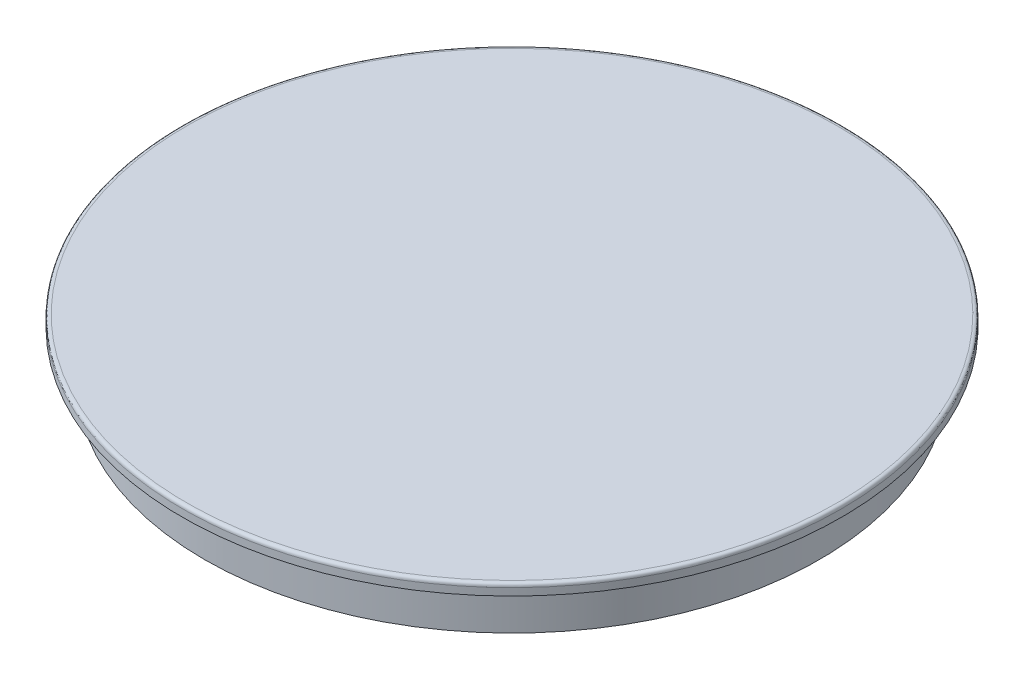
ISO-10303-21;
HEADER;
FILE_DESCRIPTION(('STEP AP214'),'2;1');
FILE_NAME('part.step','',(''),(''),'','','');
FILE_SCHEMA(('AUTOMOTIVE_DESIGN { 1 0 10303 214 1 1 1 1 }'));
ENDSEC;
DATA;
#1=APPLICATION_CONTEXT('core data for automotive mechanical design processes');
#2=APPLICATION_PROTOCOL_DEFINITION('international standard','automotive_design',2000,#1);
#3=PRODUCT_CONTEXT('',#1,'mechanical');
#4=PRODUCT('Part','Part','',(#3));
#5=PRODUCT_RELATED_PRODUCT_CATEGORY('part','',(#4));
#6=PRODUCT_DEFINITION_FORMATION('','',#4);
#7=PRODUCT_DEFINITION_CONTEXT('part definition',#1,'design');
#8=PRODUCT_DEFINITION('design','',#6,#7);
#9=PRODUCT_DEFINITION_SHAPE('','',#8);
#10=(LENGTH_UNIT() NAMED_UNIT(*) SI_UNIT(.MILLI.,.METRE.));
#11=(NAMED_UNIT(*) PLANE_ANGLE_UNIT() SI_UNIT($,.RADIAN.));
#12=(NAMED_UNIT(*) SI_UNIT($,.STERADIAN.) SOLID_ANGLE_UNIT());
#13=UNCERTAINTY_MEASURE_WITH_UNIT(LENGTH_MEASURE(1.E-05),#10,'distance_accuracy_value','');
#14=(GEOMETRIC_REPRESENTATION_CONTEXT(3) GLOBAL_UNCERTAINTY_ASSIGNED_CONTEXT((#13)) GLOBAL_UNIT_ASSIGNED_CONTEXT((#10,
#11,#12)) REPRESENTATION_CONTEXT('',''));
#15=CARTESIAN_POINT('',(0.,0.,0.));
#16=DIRECTION('',(0.,0.,1.));
#17=DIRECTION('',(1.,0.,0.));
#18=AXIS2_PLACEMENT_3D('',#15,#16,#17);
#19=CARTESIAN_POINT('',(42.,0.,0.));
#20=DIRECTION('',(0.,-1.,0.));
#21=DIRECTION('',(0.,0.,-1.));
#22=AXIS2_PLACEMENT_3D('',#19,#20,#21);
#23=PLANE('',#22);
#24=CARTESIAN_POINT('',(0.,0.,0.));
#25=DIRECTION('',(0.,-1.,0.));
#26=DIRECTION('',(0.,0.,-1.));
#27=AXIS2_PLACEMENT_3D('',#24,#25,#26);
#28=CIRCLE('',#27,42.);
#29=CARTESIAN_POINT('',(0.,0.,-42.));
#30=VERTEX_POINT('',#29);
#31=EDGE_CURVE('E60',#30,#30,#28,.T.);
#32=ORIENTED_EDGE('',*,*,#31,.T.);
#33=EDGE_LOOP('',(#32));
#34=FACE_BOUND('',#33,.T.);
#35=ADVANCED_FACE('F32',(#34),#23,.T.);
#36=CARTESIAN_POINT('',(0.,8.,0.));
#37=DIRECTION('',(0.,1.,0.));
#38=DIRECTION('',(0.,0.,1.));
#39=AXIS2_PLACEMENT_3D('',#36,#37,#38);
#40=PLANE('',#39);
#41=CARTESIAN_POINT('',(0.,8.,-44.5));
#42=CARTESIAN_POINT('',(5.82425252165576,8.,-44.5));
#43=CARTESIAN_POINT('',(17.4727575649674,8.00000000000001,-42.182968285401));
#44=CARTESIAN_POINT('',(32.2854461816099,8.,-32.28544618161));
#45=CARTESIAN_POINT('',(42.182968285401,8.,-17.4727575649673));
#46=CARTESIAN_POINT('',(45.6585158572995,8.,0.));
#47=CARTESIAN_POINT('',(42.182968285401,8.,17.4727575649672));
#48=CARTESIAN_POINT('',(32.28544618161,8.,32.28544618161));
#49=CARTESIAN_POINT('',(17.4727575649673,8.,42.182968285401));
#50=CARTESIAN_POINT('',(0.,8.,45.6585158572995));
#51=CARTESIAN_POINT('',(-17.4727575649672,8.,42.182968285401));
#52=CARTESIAN_POINT('',(-32.28544618161,8.,32.28544618161));
#53=CARTESIAN_POINT('',(-42.182968285401,8.,17.4727575649672));
#54=CARTESIAN_POINT('',(-45.6585158572995,8.,0.));
#55=CARTESIAN_POINT('',(-42.182968285401,8.,-17.4727575649674));
#56=CARTESIAN_POINT('',(-32.28544618161,8.,-32.2854461816099));
#57=CARTESIAN_POINT('',(-17.4727575649671,8.,-42.1829682854011));
#58=CARTESIAN_POINT('',(-5.82425252165574,8.,-44.5));
#59=CARTESIAN_POINT('',(0.,8.,-44.5));
#60=B_SPLINE_CURVE_WITH_KNOTS('',3,(#41,#42,#43,#44,#45,#46,#47,#48,#49,#50,#51,#52,#53,#54,#55,
#56,#57,#58,#59),.UNSPECIFIED.,.T.,.F.,(4,1,1,1,1,1,1,1,1,1,1,1,1,1,1,1,4),(-3.14159265358979,
-2.74889357189107,-2.35619449019234,-1.96349540849362,-1.5707963267949,-1.17809724509617,
-0.785398163397448,-0.392699081698724,0.,0.392699081698724,0.785398163397448,1.17809724509617,
1.5707963267949,1.96349540849362,2.35619449019235,2.74889357189107,3.14159265358979),.UNSPECIFIED.);
#61=CARTESIAN_POINT('',(0.,8.,-44.5));
#62=VERTEX_POINT('',#61);
#63=EDGE_CURVE('E10',#62,#62,#60,.F.);
#64=ORIENTED_EDGE('',*,*,#63,.T.);
#65=EDGE_LOOP('',(#64));
#66=FACE_BOUND('',#65,.T.);
#67=ADVANCED_FACE('F79',(#66),#40,.T.);
#68=CARTESIAN_POINT('',(0.,0.,0.));
#69=DIRECTION('',(0.,-1.,0.));
#70=DIRECTION('',(0.,0.,-1.));
#71=AXIS2_PLACEMENT_3D('',#68,#69,#70);
#72=CYLINDRICAL_SURFACE('',#71,45.);
#73=CARTESIAN_POINT('',(0.,7.5,-45.));
#74=CARTESIAN_POINT('',(-5.88969356122491,7.5,-45.));
#75=CARTESIAN_POINT('',(-17.6690806836746,7.50000000000001,-42.6569342211921));
#76=CARTESIAN_POINT('',(-32.6482040038753,7.5,-32.6482040038752));
#77=CARTESIAN_POINT('',(-42.656934221192,7.50000000000001,-17.6690806836749));
#78=CARTESIAN_POINT('',(-46.171532889404,7.5,0.));
#79=CARTESIAN_POINT('',(-42.656934221192,7.5,17.6690806836747));
#80=CARTESIAN_POINT('',(-32.6482040038752,7.50000000000001,32.6482040038753));
#81=CARTESIAN_POINT('',(-17.6690806836747,7.5,42.656934221192));
#82=CARTESIAN_POINT('',(0.,7.50000000000001,46.171532889404));
#83=CARTESIAN_POINT('',(17.6690806836747,7.50000000000001,42.6569342211921));
#84=CARTESIAN_POINT('',(32.6482040038753,7.50000000000001,32.6482040038753));
#85=CARTESIAN_POINT('',(42.6569342211921,7.5,17.6690806836747));
#86=CARTESIAN_POINT('',(46.171532889404,7.50000000000001,0.));
#87=CARTESIAN_POINT('',(42.6569342211921,7.5,-17.6690806836748));
#88=CARTESIAN_POINT('',(32.6482040038752,7.5,-32.6482040038753));
#89=CARTESIAN_POINT('',(17.6690806836749,7.50000000000001,-42.656934221192));
#90=CARTESIAN_POINT('',(5.88969356122492,7.5,-45.));
#91=CARTESIAN_POINT('',(0.,7.5,-45.));
#92=B_SPLINE_CURVE_WITH_KNOTS('',3,(#73,#74,#75,#76,#77,#78,#79,#80,#81,#82,#83,#84,#85,#86,#87,
#88,#89,#90,#91),.UNSPECIFIED.,.T.,.F.,(4,1,1,1,1,1,1,1,1,1,1,1,1,1,1,1,4),(-3.14159265358979,
-2.74889357189107,-2.35619449019235,-1.96349540849362,-1.5707963267949,-1.17809724509617,
-0.785398163397448,-0.392699081698724,0.,0.392699081698724,0.785398163397448,1.17809724509617,
1.5707963267949,1.96349540849362,2.35619449019234,2.74889357189107,3.14159265358979),.UNSPECIFIED.);
#93=CARTESIAN_POINT('',(0.,7.5,-45.));
#94=VERTEX_POINT('',#93);
#95=EDGE_CURVE('E45',#94,#94,#92,.F.);
#96=ORIENTED_EDGE('',*,*,#95,.T.);
#97=EDGE_LOOP('',(#96));
#98=FACE_BOUND('',#97,.T.);
#99=CARTESIAN_POINT('',(0.,6.5,0.));
#100=DIRECTION('',(0.,-1.,0.));
#101=DIRECTION('',(0.,0.,-1.));
#102=AXIS2_PLACEMENT_3D('',#99,#100,#101);
#103=CIRCLE('',#102,45.);
#104=CARTESIAN_POINT('',(0.,6.5,-45.));
#105=VERTEX_POINT('',#104);
#106=EDGE_CURVE('E50',#105,#105,#103,.T.);
#107=ORIENTED_EDGE('',*,*,#106,.F.);
#108=EDGE_LOOP('',(#107));
#109=FACE_BOUND('',#108,.T.);
#110=ADVANCED_FACE('F68',(#98,#109),#72,.T.);
#111=CARTESIAN_POINT('',(45.,6.5,0.));
#112=DIRECTION('',(0.,-1.,0.));
#113=DIRECTION('',(0.,0.,-1.));
#114=AXIS2_PLACEMENT_3D('',#111,#112,#113);
#115=PLANE('',#114);
#116=ORIENTED_EDGE('',*,*,#106,.T.);
#117=EDGE_LOOP('',(#116));
#118=FACE_BOUND('',#117,.T.);
#119=CARTESIAN_POINT('',(0.,6.5,0.));
#120=DIRECTION('',(0.,-1.,0.));
#121=DIRECTION('',(0.,0.,-1.));
#122=AXIS2_PLACEMENT_3D('',#119,#120,#121);
#123=CIRCLE('',#122,42.);
#124=CARTESIAN_POINT('',(0.,6.5,-42.));
#125=VERTEX_POINT('',#124);
#126=EDGE_CURVE('E55',#125,#125,#123,.T.);
#127=ORIENTED_EDGE('',*,*,#126,.F.);
#128=EDGE_LOOP('',(#127));
#129=FACE_BOUND('',#128,.T.);
#130=ADVANCED_FACE('F78',(#118,#129),#115,.T.);
#131=CARTESIAN_POINT('',(0.,0.,0.));
#132=DIRECTION('',(0.,-1.,0.));
#133=DIRECTION('',(0.,0.,-1.));
#134=AXIS2_PLACEMENT_3D('',#131,#132,#133);
#135=CYLINDRICAL_SURFACE('',#134,42.);
#136=ORIENTED_EDGE('',*,*,#126,.T.);
#137=EDGE_LOOP('',(#136));
#138=FACE_BOUND('',#137,.T.);
#139=ORIENTED_EDGE('',*,*,#31,.F.);
#140=EDGE_LOOP('',(#139));
#141=FACE_BOUND('',#140,.T.);
#142=ADVANCED_FACE('F102',(#138,#141),#135,.T.);
#143=CARTESIAN_POINT('',(0.,8.,-44.5));
#144=CARTESIAN_POINT('',(-5.82425252165574,8.,-44.5));
#145=CARTESIAN_POINT('',(-17.4727575649671,8.,-42.1829682854011));
#146=CARTESIAN_POINT('',(-32.28544618161,8.,-32.2854461816099));
#147=CARTESIAN_POINT('',(-42.182968285401,8.,-17.4727575649674));
#148=CARTESIAN_POINT('',(-45.6585158572995,8.,0.));
#149=CARTESIAN_POINT('',(-42.182968285401,8.,17.4727575649672));
#150=CARTESIAN_POINT('',(-32.28544618161,8.,32.28544618161));
#151=CARTESIAN_POINT('',(-17.4727575649672,8.,42.182968285401));
#152=CARTESIAN_POINT('',(0.,8.,45.6585158572995));
#153=CARTESIAN_POINT('',(17.4727575649673,8.,42.182968285401));
#154=CARTESIAN_POINT('',(32.28544618161,8.,32.28544618161));
#155=CARTESIAN_POINT('',(42.182968285401,8.,17.4727575649672));
#156=CARTESIAN_POINT('',(45.6585158572995,8.,0.));
#157=CARTESIAN_POINT('',(42.182968285401,8.,-17.4727575649673));
#158=CARTESIAN_POINT('',(32.2854461816099,8.,-32.28544618161));
#159=CARTESIAN_POINT('',(17.4727575649674,8.00000000000001,-42.182968285401));
#160=CARTESIAN_POINT('',(5.82425252165576,8.,-44.5));
#161=CARTESIAN_POINT('',(0.,8.,-44.5));
#162=CARTESIAN_POINT('',(0.,8.,-44.584099025767));
#163=CARTESIAN_POINT('',(-5.83525957700163,8.,-44.584099025767));
#164=CARTESIAN_POINT('',(-17.5057787310048,8.,-42.2626884322946));
#165=CARTESIAN_POINT('',(-32.3464613404938,8.,-32.3464613404936));
#166=CARTESIAN_POINT('',(-42.2626884322945,8.,-17.5057787310051));
#167=CARTESIAN_POINT('',(-45.7448043225032,8.,0.));
#168=CARTESIAN_POINT('',(-42.2626884322945,8.,17.5057787310049));
#169=CARTESIAN_POINT('',(-32.3464613404937,8.,32.3464613404937));
#170=CARTESIAN_POINT('',(-17.5057787310049,8.,42.2626884322945));
#171=CARTESIAN_POINT('',(0.,8.00000000000001,45.7448043225032));
#172=CARTESIAN_POINT('',(17.5057787310049,8.,42.2626884322945));
#173=CARTESIAN_POINT('',(32.3464613404937,8.,32.3464613404937));
#174=CARTESIAN_POINT('',(42.2626884322946,8.,17.5057787310049));
#175=CARTESIAN_POINT('',(45.7448043225032,8.,0.));
#176=CARTESIAN_POINT('',(42.2626884322946,8.,-17.5057787310049));
#177=CARTESIAN_POINT('',(32.3464613404936,8.,-32.3464613404937));
#178=CARTESIAN_POINT('',(17.505778731005,8.00000000000001,-42.2626884322945));
#179=CARTESIAN_POINT('',(5.83525957700165,8.,-44.584099025767));
#180=CARTESIAN_POINT('',(0.,8.,-44.584099025767));
#181=CARTESIAN_POINT('',(0.,8.,-44.6681980515339));
#182=CARTESIAN_POINT('',(-5.84626663234752,8.,-44.668198051534));
#183=CARTESIAN_POINT('',(-17.5387998970425,8.,-42.3424085791881));
#184=CARTESIAN_POINT('',(-32.4074764993775,8.,-32.4074764993773));
#185=CARTESIAN_POINT('',(-42.342408579188,8.,-17.5387998970427));
#186=CARTESIAN_POINT('',(-45.8310927877069,8.00000000000001,0.));
#187=CARTESIAN_POINT('',(-42.342408579188,8.,17.5387998970426));
#188=CARTESIAN_POINT('',(-32.4074764993774,8.,32.4074764993774));
#189=CARTESIAN_POINT('',(-17.5387998970426,8.,42.3424085791881));
#190=CARTESIAN_POINT('',(0.,8.00000000000001,45.8310927877069));
#191=CARTESIAN_POINT('',(17.5387998970426,8.,42.3424085791881));
#192=CARTESIAN_POINT('',(32.4074764993774,8.,32.4074764993774));
#193=CARTESIAN_POINT('',(42.3424085791881,8.,17.5387998970426));
#194=CARTESIAN_POINT('',(45.8310927877069,8.00000000000001,0.));
#195=CARTESIAN_POINT('',(42.3424085791881,8.,-17.5387998970426));
#196=CARTESIAN_POINT('',(32.4074764993774,8.,-32.4074764993774));
#197=CARTESIAN_POINT('',(17.5387998970427,8.,-42.342408579188));
#198=CARTESIAN_POINT('',(5.84626663234754,8.,-44.6681980515339));
#199=CARTESIAN_POINT('',(0.,8.,-44.6681980515339));
#200=CARTESIAN_POINT('',(0.,7.96415404008196,-44.8535533905933));
#201=CARTESIAN_POINT('',(-5.870526324503,7.96415404008196,-44.8535533905933));
#202=CARTESIAN_POINT('',(-17.6115789735089,7.96415404008195,-42.5181128126504));
#203=CARTESIAN_POINT('',(-32.5419546976623,7.96415404008196,-32.5419546976621));
#204=CARTESIAN_POINT('',(-42.5181128126502,7.96415404008196,-17.6115789735092));
#205=CARTESIAN_POINT('',(-46.0212736795648,7.96415404008197,0.));
#206=CARTESIAN_POINT('',(-42.5181128126503,7.96415404008195,17.611578973509));
#207=CARTESIAN_POINT('',(-32.5419546976622,7.96415404008196,32.5419546976623));
#208=CARTESIAN_POINT('',(-17.611578973509,7.96415404008195,42.5181128126503));
#209=CARTESIAN_POINT('',(0.,7.96415404008197,46.0212736795648));
#210=CARTESIAN_POINT('',(17.611578973509,7.96415404008195,42.5181128126503));
#211=CARTESIAN_POINT('',(32.5419546976622,7.96415404008197,32.5419546976622));
#212=CARTESIAN_POINT('',(42.5181128126503,7.96415404008195,17.611578973509));
#213=CARTESIAN_POINT('',(46.0212736795647,7.96415404008197,0.));
#214=CARTESIAN_POINT('',(42.5181128126503,7.96415404008195,-17.611578973509));
#215=CARTESIAN_POINT('',(32.5419546976622,7.96415404008196,-32.5419546976623));
#216=CARTESIAN_POINT('',(17.6115789735091,7.96415404008196,-42.5181128126502));
#217=CARTESIAN_POINT('',(5.87052632450301,7.96415404008196,-44.8535533905932));
#218=CARTESIAN_POINT('',(0.,7.96415404008196,-44.8535533905933));
#219=CARTESIAN_POINT('',(0.,7.85355339059328,-44.964154040082));
#220=CARTESIAN_POINT('',(-5.88500196746213,7.85355339059328,-44.964154040082));
#221=CARTESIAN_POINT('',(-17.6550059023863,7.85355339059328,-42.6229546933183));
#222=CARTESIAN_POINT('',(-32.6221971991616,7.85355339059327,-32.6221971991614));
#223=CARTESIAN_POINT('',(-42.6229546933182,7.85355339059328,-17.6550059023865));
#224=CARTESIAN_POINT('',(-46.1347537134638,7.85355339059328,0.));
#225=CARTESIAN_POINT('',(-42.6229546933183,7.85355339059327,17.6550059023864));
#226=CARTESIAN_POINT('',(-32.6221971991615,7.85355339059327,32.6221971991615));
#227=CARTESIAN_POINT('',(-17.6550059023864,7.85355339059328,42.6229546933183));
#228=CARTESIAN_POINT('',(0.,7.85355339059328,46.1347537134638));
#229=CARTESIAN_POINT('',(17.6550059023864,7.85355339059328,42.6229546933183));
#230=CARTESIAN_POINT('',(32.6221971991615,7.85355339059327,32.6221971991615));
#231=CARTESIAN_POINT('',(42.6229546933183,7.85355339059328,17.6550059023864));
#232=CARTESIAN_POINT('',(46.1347537134638,7.85355339059328,0.));
#233=CARTESIAN_POINT('',(42.6229546933183,7.85355339059328,-17.6550059023864));
#234=CARTESIAN_POINT('',(32.6221971991615,7.85355339059327,-32.6221971991615));
#235=CARTESIAN_POINT('',(17.6550059023865,7.85355339059328,-42.6229546933182));
#236=CARTESIAN_POINT('',(5.88500196746214,7.85355339059328,-44.9641540400819));
#237=CARTESIAN_POINT('',(0.,7.85355339059328,-44.964154040082));
#238=CARTESIAN_POINT('',(0.,7.66819805153395,-45.));
#239=CARTESIAN_POINT('',(-5.88969356122491,7.66819805153395,-45.));
#240=CARTESIAN_POINT('',(-17.6690806836746,7.66819805153395,-42.6569342211921));
#241=CARTESIAN_POINT('',(-32.6482040038753,7.66819805153395,-32.6482040038752));
#242=CARTESIAN_POINT('',(-42.656934221192,7.66819805153395,-17.6690806836749));
#243=CARTESIAN_POINT('',(-46.171532889404,7.66819805153395,0.));
#244=CARTESIAN_POINT('',(-42.656934221192,7.66819805153395,17.6690806836747));
#245=CARTESIAN_POINT('',(-32.6482040038752,7.66819805153395,32.6482040038753));
#246=CARTESIAN_POINT('',(-17.6690806836747,7.66819805153394,42.656934221192));
#247=CARTESIAN_POINT('',(0.,7.66819805153396,46.171532889404));
#248=CARTESIAN_POINT('',(17.6690806836747,7.66819805153394,42.6569342211921));
#249=CARTESIAN_POINT('',(32.6482040038753,7.66819805153395,32.6482040038753));
#250=CARTESIAN_POINT('',(42.6569342211921,7.66819805153395,17.6690806836747));
#251=CARTESIAN_POINT('',(46.171532889404,7.66819805153395,0.));
#252=CARTESIAN_POINT('',(42.6569342211921,7.66819805153395,-17.6690806836748));
#253=CARTESIAN_POINT('',(32.6482040038752,7.66819805153395,-32.6482040038753));
#254=CARTESIAN_POINT('',(17.6690806836749,7.66819805153395,-42.656934221192));
#255=CARTESIAN_POINT('',(5.88969356122492,7.66819805153395,-45.));
#256=CARTESIAN_POINT('',(0.,7.66819805153395,-45.));
#257=CARTESIAN_POINT('',(0.,7.58409902576697,-45.));
#258=CARTESIAN_POINT('',(-5.88969356122491,7.58409902576697,-45.));
#259=CARTESIAN_POINT('',(-17.6690806836746,7.58409902576698,-42.6569342211921));
#260=CARTESIAN_POINT('',(-32.6482040038753,7.58409902576697,-32.6482040038752));
#261=CARTESIAN_POINT('',(-42.656934221192,7.58409902576697,-17.6690806836749));
#262=CARTESIAN_POINT('',(-46.171532889404,7.58409902576698,0.));
#263=CARTESIAN_POINT('',(-42.656934221192,7.58409902576697,17.6690806836747));
#264=CARTESIAN_POINT('',(-32.6482040038752,7.58409902576697,32.6482040038753));
#265=CARTESIAN_POINT('',(-17.6690806836747,7.58409902576697,42.656934221192));
#266=CARTESIAN_POINT('',(0.,7.58409902576698,46.171532889404));
#267=CARTESIAN_POINT('',(17.6690806836747,7.58409902576697,42.6569342211921));
#268=CARTESIAN_POINT('',(32.6482040038753,7.58409902576697,32.6482040038753));
#269=CARTESIAN_POINT('',(42.6569342211921,7.58409902576697,17.6690806836747));
#270=CARTESIAN_POINT('',(46.171532889404,7.58409902576698,0.));
#271=CARTESIAN_POINT('',(42.6569342211921,7.58409902576697,-17.6690806836748));
#272=CARTESIAN_POINT('',(32.6482040038752,7.58409902576697,-32.6482040038753));
#273=CARTESIAN_POINT('',(17.6690806836749,7.58409902576697,-42.656934221192));
#274=CARTESIAN_POINT('',(5.88969356122492,7.58409902576697,-45.));
#275=CARTESIAN_POINT('',(0.,7.58409902576697,-45.));
#276=CARTESIAN_POINT('',(0.,7.5,-45.));
#277=CARTESIAN_POINT('',(-5.88969356122491,7.5,-45.));
#278=CARTESIAN_POINT('',(-17.6690806836746,7.5,-42.6569342211921));
#279=CARTESIAN_POINT('',(-32.6482040038753,7.5,-32.6482040038752));
#280=CARTESIAN_POINT('',(-42.656934221192,7.5,-17.6690806836749));
#281=CARTESIAN_POINT('',(-46.171532889404,7.5,0.));
#282=CARTESIAN_POINT('',(-42.656934221192,7.5,17.6690806836747));
#283=CARTESIAN_POINT('',(-32.6482040038752,7.5,32.6482040038753));
#284=CARTESIAN_POINT('',(-17.6690806836747,7.5,42.656934221192));
#285=CARTESIAN_POINT('',(0.,7.5,46.171532889404));
#286=CARTESIAN_POINT('',(17.6690806836747,7.5,42.6569342211921));
#287=CARTESIAN_POINT('',(32.6482040038753,7.5,32.6482040038753));
#288=CARTESIAN_POINT('',(42.6569342211921,7.5,17.6690806836747));
#289=CARTESIAN_POINT('',(46.171532889404,7.5,0.));
#290=CARTESIAN_POINT('',(42.6569342211921,7.5,-17.6690806836748));
#291=CARTESIAN_POINT('',(32.6482040038752,7.5,-32.6482040038753));
#292=CARTESIAN_POINT('',(17.6690806836749,7.5,-42.656934221192));
#293=CARTESIAN_POINT('',(5.88969356122492,7.5,-45.));
#294=CARTESIAN_POINT('',(0.,7.5,-45.));
#295=B_SPLINE_SURFACE_WITH_KNOTS('',5,3,((#143,#144,#145,#146,#147,#148,#149,#150,#151,#152,
#153,#154,#155,#156,#157,#158,#159,#160,#161),(#162,#163,#164,#165,#166,#167,#168,#169,#170,
#171,#172,#173,#174,#175,#176,#177,#178,#179,#180),(#181,#182,#183,#184,#185,#186,#187,#188,
#189,#190,#191,#192,#193,#194,#195,#196,#197,#198,#199),(#200,#201,#202,#203,#204,#205,#206,
#207,#208,#209,#210,#211,#212,#213,#214,#215,#216,#217,#218),(#219,#220,#221,#222,#223,#224,
#225,#226,#227,#228,#229,#230,#231,#232,#233,#234,#235,#236,#237),(#238,#239,#240,#241,#242,
#243,#244,#245,#246,#247,#248,#249,#250,#251,#252,#253,#254,#255,#256),(#257,#258,#259,#260,
#261,#262,#263,#264,#265,#266,#267,#268,#269,#270,#271,#272,#273,#274,#275),(#276,#277,#278,
#279,#280,#281,#282,#283,#284,#285,#286,#287,#288,#289,#290,#291,#292,#293,#294)),.UNSPECIFIED.,
.F.,.T.,.F.,(6,2,6),(4,1,1,1,1,1,1,1,1,1,1,1,1,1,1,1,4),(0.,0.5,1.),(-3.14159265358979,
-2.74889357189107,-2.35619449019235,-1.96349540849362,-1.5707963267949,-1.17809724509617,
-0.785398163397448,-0.392699081698724,0.,0.392699081698724,0.785398163397448,1.17809724509617,
1.5707963267949,1.96349540849362,2.35619449019234,2.74889357189107,3.14159265358979),.UNSPECIFIED.);
#296=ORIENTED_EDGE('',*,*,#63,.F.);
#297=EDGE_LOOP('',(#296));
#298=FACE_BOUND('',#297,.T.);
#299=ORIENTED_EDGE('',*,*,#95,.F.);
#300=EDGE_LOOP('',(#299));
#301=FACE_BOUND('',#300,.T.);
#302=ADVANCED_FACE('F35',(#298,#301),#295,.T.);
#303=CLOSED_SHELL('',(#35,#67,#110,#130,#142,#302));
#304=MANIFOLD_SOLID_BREP('B2',#303);
#305=ADVANCED_BREP_SHAPE_REPRESENTATION('',(#18,#304),#14);
#306=SHAPE_DEFINITION_REPRESENTATION(#9,#305);
ENDSEC;
END-ISO-10303-21;
